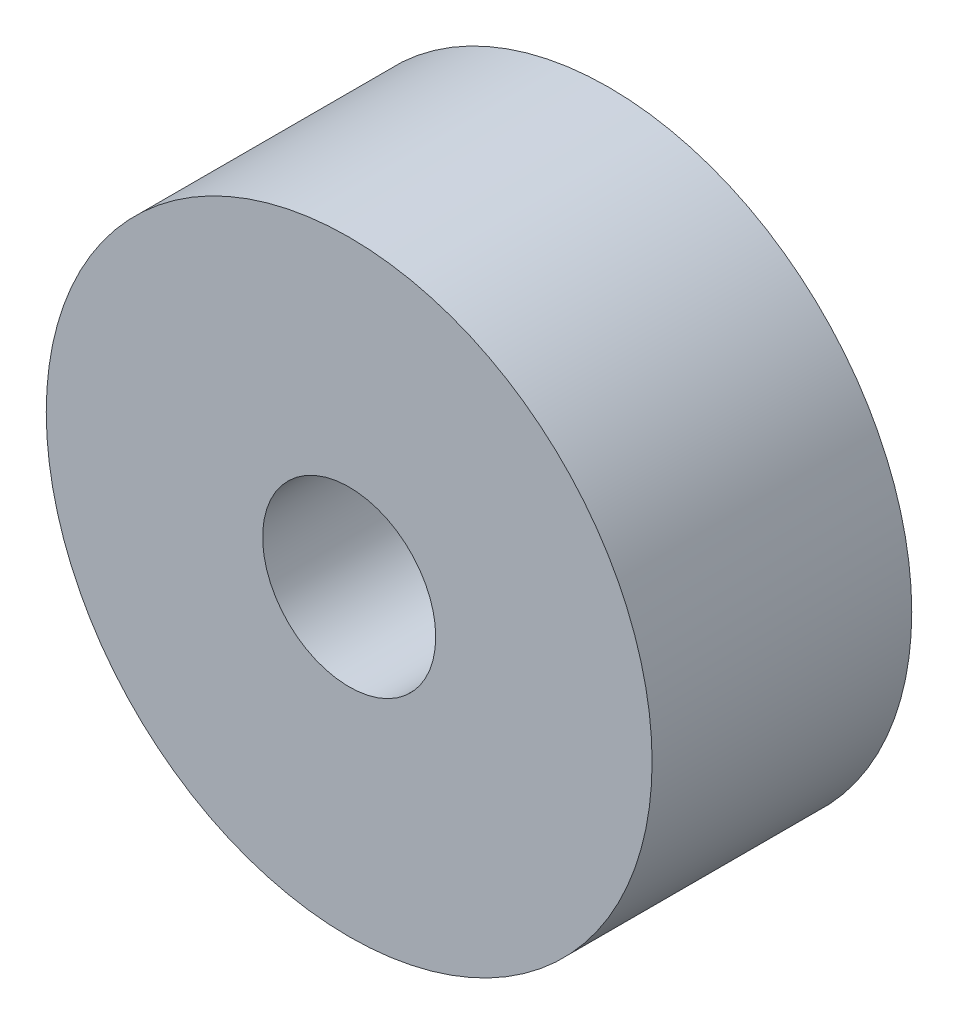
ISO-10303-21;
HEADER;
FILE_DESCRIPTION(('STEP AP214'),'2;1');
FILE_NAME('part.step','',(''),(''),'','','');
FILE_SCHEMA(('AUTOMOTIVE_DESIGN { 1 0 10303 214 1 1 1 1 }'));
ENDSEC;
DATA;
#1=APPLICATION_CONTEXT('core data for automotive mechanical design processes');
#2=APPLICATION_PROTOCOL_DEFINITION('international standard','automotive_design',2000,#1);
#3=PRODUCT_CONTEXT('',#1,'mechanical');
#4=PRODUCT('Part','Part','',(#3));
#5=PRODUCT_RELATED_PRODUCT_CATEGORY('part','',(#4));
#6=PRODUCT_DEFINITION_FORMATION('','',#4);
#7=PRODUCT_DEFINITION_CONTEXT('part definition',#1,'design');
#8=PRODUCT_DEFINITION('design','',#6,#7);
#9=PRODUCT_DEFINITION_SHAPE('','',#8);
#10=(LENGTH_UNIT() NAMED_UNIT(*) SI_UNIT(.MILLI.,.METRE.));
#11=(NAMED_UNIT(*) PLANE_ANGLE_UNIT() SI_UNIT($,.RADIAN.));
#12=(NAMED_UNIT(*) SI_UNIT($,.STERADIAN.) SOLID_ANGLE_UNIT());
#13=UNCERTAINTY_MEASURE_WITH_UNIT(LENGTH_MEASURE(1.E-05),#10,'distance_accuracy_value','');
#14=(GEOMETRIC_REPRESENTATION_CONTEXT(3) GLOBAL_UNCERTAINTY_ASSIGNED_CONTEXT((#13)) GLOBAL_UNIT_ASSIGNED_CONTEXT((#10,
#11,#12)) REPRESENTATION_CONTEXT('',''));
#15=CARTESIAN_POINT('',(0.,0.,0.));
#16=DIRECTION('',(0.,0.,1.));
#17=DIRECTION('',(1.,0.,0.));
#18=AXIS2_PLACEMENT_3D('',#15,#16,#17);
#19=CARTESIAN_POINT('',(0.,0.,15.));
#20=DIRECTION('',(0.,0.,1.));
#21=DIRECTION('',(1.,0.,0.));
#22=AXIS2_PLACEMENT_3D('',#19,#20,#21);
#23=PLANE('',#22);
#24=CARTESIAN_POINT('',(0.,0.,15.));
#25=DIRECTION('',(0.,0.,1.));
#26=DIRECTION('',(1.,0.,0.));
#27=AXIS2_PLACEMENT_3D('',#24,#25,#26);
#28=CIRCLE('',#27,35.);
#29=CARTESIAN_POINT('',(35.,0.,15.));
#30=VERTEX_POINT('',#29);
#31=EDGE_CURVE('E10',#30,#30,#28,.T.);
#32=ORIENTED_EDGE('',*,*,#31,.T.);
#33=EDGE_LOOP('',(#32));
#34=FACE_BOUND('',#33,.T.);
#35=CARTESIAN_POINT('',(0.,0.,15.));
#36=DIRECTION('',(0.,0.,1.));
#37=DIRECTION('',(1.,0.,0.));
#38=AXIS2_PLACEMENT_3D('',#35,#36,#37);
#39=CIRCLE('',#38,10.);
#40=CARTESIAN_POINT('',(10.,0.,15.));
#41=VERTEX_POINT('',#40);
#42=EDGE_CURVE('E46',#41,#41,#39,.T.);
#43=ORIENTED_EDGE('',*,*,#42,.F.);
#44=EDGE_LOOP('',(#43));
#45=FACE_BOUND('',#44,.T.);
#46=ADVANCED_FACE('F35',(#34,#45),#23,.T.);
#47=CARTESIAN_POINT('',(0.,0.,-15.));
#48=DIRECTION('',(0.,0.,1.));
#49=DIRECTION('',(1.,0.,0.));
#50=AXIS2_PLACEMENT_3D('',#47,#48,#49);
#51=PLANE('',#50);
#52=CARTESIAN_POINT('',(0.,0.,-15.));
#53=DIRECTION('',(0.,0.,1.));
#54=DIRECTION('',(1.,0.,0.));
#55=AXIS2_PLACEMENT_3D('',#52,#53,#54);
#56=CIRCLE('',#55,35.);
#57=CARTESIAN_POINT('',(35.,0.,-15.));
#58=VERTEX_POINT('',#57);
#59=EDGE_CURVE('E39',#58,#58,#56,.T.);
#60=ORIENTED_EDGE('',*,*,#59,.F.);
#61=EDGE_LOOP('',(#60));
#62=FACE_BOUND('',#61,.T.);
#63=CARTESIAN_POINT('',(0.,0.,-15.));
#64=DIRECTION('',(0.,0.,1.));
#65=DIRECTION('',(1.,0.,0.));
#66=AXIS2_PLACEMENT_3D('',#63,#64,#65);
#67=CIRCLE('',#66,10.);
#68=CARTESIAN_POINT('',(10.,0.,-15.));
#69=VERTEX_POINT('',#68);
#70=EDGE_CURVE('E48',#69,#69,#67,.T.);
#71=ORIENTED_EDGE('',*,*,#70,.T.);
#72=EDGE_LOOP('',(#71));
#73=FACE_BOUND('',#72,.T.);
#74=ADVANCED_FACE('F58',(#62,#73),#51,.F.);
#75=CARTESIAN_POINT('',(0.,0.,15.));
#76=DIRECTION('',(0.,0.,-1.));
#77=DIRECTION('',(-1.,0.,0.));
#78=AXIS2_PLACEMENT_3D('',#75,#76,#77);
#79=CYLINDRICAL_SURFACE('',#78,35.);
#80=ORIENTED_EDGE('',*,*,#31,.F.);
#81=EDGE_LOOP('',(#80));
#82=FACE_BOUND('',#81,.T.);
#83=ORIENTED_EDGE('',*,*,#59,.T.);
#84=EDGE_LOOP('',(#83));
#85=FACE_BOUND('',#84,.T.);
#86=ADVANCED_FACE('F37',(#82,#85),#79,.T.);
#87=CARTESIAN_POINT('',(0.,0.,15.));
#88=DIRECTION('',(0.,0.,-1.));
#89=DIRECTION('',(-1.,0.,0.));
#90=AXIS2_PLACEMENT_3D('',#87,#88,#89);
#91=CYLINDRICAL_SURFACE('',#90,10.);
#92=ORIENTED_EDGE('',*,*,#42,.T.);
#93=EDGE_LOOP('',(#92));
#94=FACE_BOUND('',#93,.T.);
#95=ORIENTED_EDGE('',*,*,#70,.F.);
#96=EDGE_LOOP('',(#95));
#97=FACE_BOUND('',#96,.T.);
#98=ADVANCED_FACE('F54',(#94,#97),#91,.F.);
#99=CLOSED_SHELL('',(#46,#74,#86,#98));
#100=MANIFOLD_SOLID_BREP('B2',#99);
#101=ADVANCED_BREP_SHAPE_REPRESENTATION('',(#18,#100),#14);
#102=SHAPE_DEFINITION_REPRESENTATION(#9,#101);
ENDSEC;
END-ISO-10303-21;
